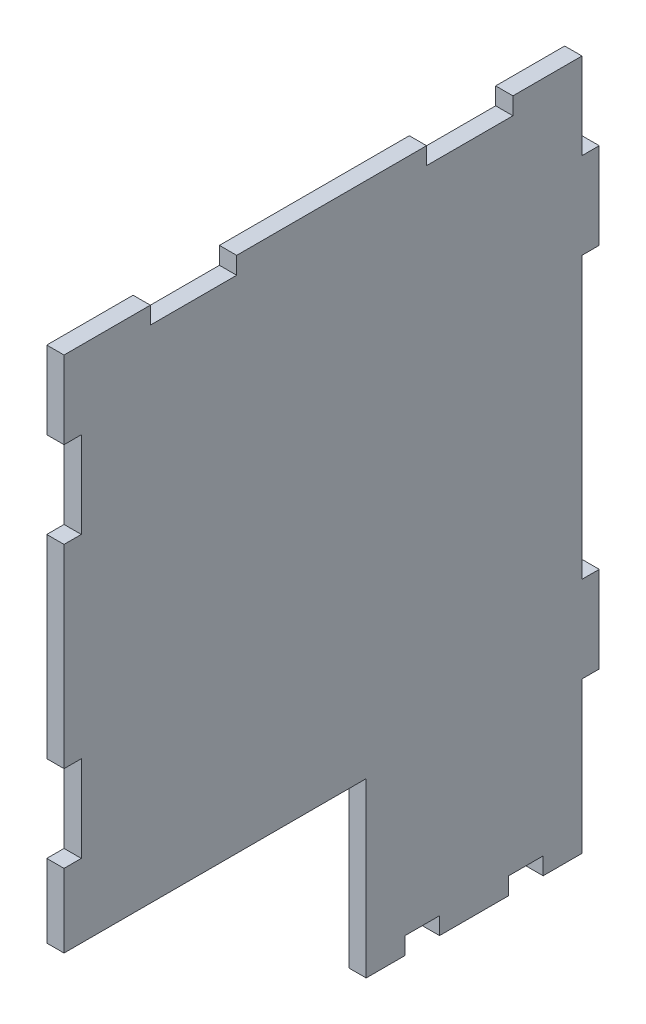
ISO-10303-21;
HEADER;
FILE_DESCRIPTION(('STEP AP214'),'2;1');
FILE_NAME('part.step','',(''),(''),'','','');
FILE_SCHEMA(('AUTOMOTIVE_DESIGN { 1 0 10303 214 1 1 1 1 }'));
ENDSEC;
DATA;
#1=APPLICATION_CONTEXT('core data for automotive mechanical design processes');
#2=APPLICATION_PROTOCOL_DEFINITION('international standard','automotive_design',2000,#1);
#3=PRODUCT_CONTEXT('',#1,'mechanical');
#4=PRODUCT('Part','Part','',(#3));
#5=PRODUCT_RELATED_PRODUCT_CATEGORY('part','',(#4));
#6=PRODUCT_DEFINITION_FORMATION('','',#4);
#7=PRODUCT_DEFINITION_CONTEXT('part definition',#1,'design');
#8=PRODUCT_DEFINITION('design','',#6,#7);
#9=PRODUCT_DEFINITION_SHAPE('','',#8);
#10=(LENGTH_UNIT() NAMED_UNIT(*) SI_UNIT(.MILLI.,.METRE.));
#11=(NAMED_UNIT(*) PLANE_ANGLE_UNIT() SI_UNIT($,.RADIAN.));
#12=(NAMED_UNIT(*) SI_UNIT($,.STERADIAN.) SOLID_ANGLE_UNIT());
#13=UNCERTAINTY_MEASURE_WITH_UNIT(LENGTH_MEASURE(1.E-05),#10,'distance_accuracy_value','');
#14=(GEOMETRIC_REPRESENTATION_CONTEXT(3) GLOBAL_UNCERTAINTY_ASSIGNED_CONTEXT((#13)) GLOBAL_UNIT_ASSIGNED_CONTEXT((#10,
#11,#12)) REPRESENTATION_CONTEXT('',''));
#15=CARTESIAN_POINT('',(0.,0.,0.));
#16=DIRECTION('',(0.,0.,1.));
#17=DIRECTION('',(1.,0.,0.));
#18=AXIS2_PLACEMENT_3D('',#15,#16,#17);
#19=CARTESIAN_POINT('',(-101.6,101.6,152.4));
#20=DIRECTION('',(0.,-1.,0.));
#21=DIRECTION('',(0.,0.,-1.));
#22=AXIS2_PLACEMENT_3D('',#19,#20,#21);
#23=PLANE('',#22);
#24=DIRECTION('',(0.,0.,-1.));
#25=VECTOR('',#24,1.);
#26=CARTESIAN_POINT('',(-96.52,101.6,152.4));
#27=LINE('',#26,#25);
#28=CARTESIAN_POINT('',(-96.52,101.6,101.6));
#29=VERTEX_POINT('',#28);
#30=CARTESIAN_POINT('',(-96.52,101.6,45.72));
#31=VERTEX_POINT('',#30);
#32=EDGE_CURVE('E548',#29,#31,#27,.T.);
#33=ORIENTED_EDGE('',*,*,#32,.T.);
#34=DIRECTION('',(1.,0.,0.));
#35=VECTOR('',#34,1.);
#36=CARTESIAN_POINT('',(-101.6,101.6,45.72));
#37=LINE('',#36,#35);
#38=CARTESIAN_POINT('',(-101.6,101.6,45.72));
#39=VERTEX_POINT('',#38);
#40=EDGE_CURVE('E312',#39,#31,#37,.T.);
#41=ORIENTED_EDGE('',*,*,#40,.F.);
#42=DIRECTION('',(0.,0.,-1.));
#43=VECTOR('',#42,1.);
#44=CARTESIAN_POINT('',(-101.6,101.6,152.4));
#45=LINE('',#44,#43);
#46=CARTESIAN_POINT('',(-101.6,101.6,101.6));
#47=VERTEX_POINT('',#46);
#48=EDGE_CURVE('E303',#47,#39,#45,.T.);
#49=ORIENTED_EDGE('',*,*,#48,.F.);
#50=DIRECTION('',(1.,0.,0.));
#51=VECTOR('',#50,1.);
#52=CARTESIAN_POINT('',(-101.6,101.6,101.6));
#53=LINE('',#52,#51);
#54=EDGE_CURVE('E386',#47,#29,#53,.T.);
#55=ORIENTED_EDGE('',*,*,#54,.T.);
#56=EDGE_LOOP('',(#33,#41,#49,#55));
#57=FACE_BOUND('',#56,.T.);
#58=ADVANCED_FACE('F33',(#57),#23,.F.);
#59=CARTESIAN_POINT('',(-96.52,101.6,152.4));
#60=VERTEX_POINT('',#59);
#61=CARTESIAN_POINT('',(-96.52,101.6,127.));
#62=VERTEX_POINT('',#61);
#63=EDGE_CURVE('E545',#60,#62,#27,.T.);
#64=ORIENTED_EDGE('',*,*,#63,.T.);
#65=DIRECTION('',(1.,0.,0.));
#66=VECTOR('',#65,1.);
#67=CARTESIAN_POINT('',(-101.6,101.6,127.));
#68=LINE('',#67,#66);
#69=CARTESIAN_POINT('',(-101.6,101.6,127.));
#70=VERTEX_POINT('',#69);
#71=EDGE_CURVE('E383',#70,#62,#68,.T.);
#72=ORIENTED_EDGE('',*,*,#71,.F.);
#73=CARTESIAN_POINT('',(-101.6,101.6,152.4));
#74=VERTEX_POINT('',#73);
#75=EDGE_CURVE('E541',#74,#70,#45,.T.);
#76=ORIENTED_EDGE('',*,*,#75,.F.);
#77=DIRECTION('',(-1.,0.,0.));
#78=VECTOR('',#77,1.);
#79=CARTESIAN_POINT('',(-101.6,101.6,152.4));
#80=LINE('',#79,#78);
#81=EDGE_CURVE('E522',#60,#74,#80,.T.);
#82=ORIENTED_EDGE('',*,*,#81,.F.);
#83=EDGE_LOOP('',(#64,#72,#76,#82));
#84=FACE_BOUND('',#83,.T.);
#85=ADVANCED_FACE('F614',(#84),#23,.F.);
#86=CARTESIAN_POINT('',(0.,0.,152.4));
#87=DIRECTION('',(0.,0.,1.));
#88=DIRECTION('',(1.,0.,0.));
#89=AXIS2_PLACEMENT_3D('',#86,#87,#88);
#90=PLANE('',#89);
#91=DIRECTION('',(1.,0.,0.));
#92=VECTOR('',#91,1.);
#93=CARTESIAN_POINT('',(-101.6,-3.81000000000001,152.4));
#94=LINE('',#93,#92);
#95=CARTESIAN_POINT('',(-101.6,-3.81000000000001,152.4));
#96=VERTEX_POINT('',#95);
#97=CARTESIAN_POINT('',(-96.52,-3.81000000000001,152.4));
#98=VERTEX_POINT('',#97);
#99=EDGE_CURVE('E333',#96,#98,#94,.T.);
#100=ORIENTED_EDGE('',*,*,#99,.T.);
#101=DIRECTION('',(0.,1.,0.));
#102=VECTOR('',#101,1.);
#103=CARTESIAN_POINT('',(-96.52,101.6,152.4));
#104=LINE('',#103,#102);
#105=CARTESIAN_POINT('',(-96.52,53.34,152.4));
#106=VERTEX_POINT('',#105);
#107=EDGE_CURVE('E523',#98,#106,#104,.T.);
#108=ORIENTED_EDGE('',*,*,#107,.T.);
#109=DIRECTION('',(1.,0.,0.));
#110=VECTOR('',#109,1.);
#111=CARTESIAN_POINT('',(-101.6,53.34,152.4));
#112=LINE('',#111,#110);
#113=CARTESIAN_POINT('',(-101.6,53.34,152.4));
#114=VERTEX_POINT('',#113);
#115=EDGE_CURVE('E328',#114,#106,#112,.T.);
#116=ORIENTED_EDGE('',*,*,#115,.F.);
#117=DIRECTION('',(0.,-1.,0.));
#118=VECTOR('',#117,1.);
#119=CARTESIAN_POINT('',(-101.6,101.6,152.4));
#120=LINE('',#119,#118);
#121=EDGE_CURVE('E517',#114,#96,#120,.T.);
#122=ORIENTED_EDGE('',*,*,#121,.T.);
#123=EDGE_LOOP('',(#100,#108,#116,#122));
#124=FACE_BOUND('',#123,.T.);
#125=ADVANCED_FACE('F625',(#124),#90,.T.);
#126=DIRECTION('',(1.,0.,0.));
#127=VECTOR('',#126,1.);
#128=CARTESIAN_POINT('',(-101.6,78.74,152.4));
#129=LINE('',#128,#127);
#130=CARTESIAN_POINT('',(-101.6,78.74,152.4));
#131=VERTEX_POINT('',#130);
#132=CARTESIAN_POINT('',(-96.52,78.74,152.4));
#133=VERTEX_POINT('',#132);
#134=EDGE_CURVE('E310',#131,#133,#129,.T.);
#135=ORIENTED_EDGE('',*,*,#134,.T.);
#136=EDGE_CURVE('E516',#133,#60,#104,.T.);
#137=ORIENTED_EDGE('',*,*,#136,.T.);
#138=ORIENTED_EDGE('',*,*,#81,.T.);
#139=EDGE_CURVE('E513',#74,#131,#120,.T.);
#140=ORIENTED_EDGE('',*,*,#139,.T.);
#141=EDGE_LOOP('',(#135,#137,#138,#140));
#142=FACE_BOUND('',#141,.T.);
#143=ADVANCED_FACE('F619',(#142),#90,.T.);
#144=CARTESIAN_POINT('',(0.,0.,0.));
#145=DIRECTION('',(0.,0.,1.));
#146=DIRECTION('',(1.,0.,0.));
#147=AXIS2_PLACEMENT_3D('',#144,#145,#146);
#148=PLANE('',#147);
#149=DIRECTION('',(1.,0.,0.));
#150=VECTOR('',#149,1.);
#151=CARTESIAN_POINT('',(-101.6,76.1999999999999,0.));
#152=LINE('',#151,#150);
#153=CARTESIAN_POINT('',(-101.6,76.1999999999999,0.));
#154=VERTEX_POINT('',#153);
#155=CARTESIAN_POINT('',(-96.52,76.1999999999999,0.));
#156=VERTEX_POINT('',#155);
#157=EDGE_CURVE('E403',#154,#156,#152,.T.);
#158=ORIENTED_EDGE('',*,*,#157,.F.);
#159=DIRECTION('',(0.,-1.,0.));
#160=VECTOR('',#159,1.);
#161=CARTESIAN_POINT('',(-101.6,101.6,0.));
#162=LINE('',#161,#160);
#163=CARTESIAN_POINT('',(-101.6,101.6,0.));
#164=VERTEX_POINT('',#163);
#165=EDGE_CURVE('E526',#164,#154,#162,.T.);
#166=ORIENTED_EDGE('',*,*,#165,.F.);
#167=DIRECTION('',(-1.,0.,0.));
#168=VECTOR('',#167,1.);
#169=CARTESIAN_POINT('',(-101.6,101.6,0.));
#170=LINE('',#169,#168);
#171=CARTESIAN_POINT('',(-96.52,101.6,0.));
#172=VERTEX_POINT('',#171);
#173=EDGE_CURVE('E537',#172,#164,#170,.T.);
#174=ORIENTED_EDGE('',*,*,#173,.F.);
#175=DIRECTION('',(0.,1.,0.));
#176=VECTOR('',#175,1.);
#177=CARTESIAN_POINT('',(-96.52,101.6,0.));
#178=LINE('',#177,#176);
#179=EDGE_CURVE('E533',#156,#172,#178,.T.);
#180=ORIENTED_EDGE('',*,*,#179,.F.);
#181=EDGE_LOOP('',(#158,#166,#174,#180));
#182=FACE_BOUND('',#181,.T.);
#183=ADVANCED_FACE('F595',(#182),#148,.F.);
#184=DIRECTION('',(-1.,0.,0.));
#185=VECTOR('',#184,1.);
#186=CARTESIAN_POINT('',(-96.52,-57.15,0.));
#187=LINE('',#186,#185);
#188=CARTESIAN_POINT('',(-96.52,-57.15,0.));
#189=VERTEX_POINT('',#188);
#190=CARTESIAN_POINT('',(-101.6,-57.15,0.));
#191=VERTEX_POINT('',#190);
#192=EDGE_CURVE('E420',#189,#191,#187,.T.);
#193=ORIENTED_EDGE('',*,*,#192,.F.);
#194=CARTESIAN_POINT('',(-96.52,-101.6,0.));
#195=VERTEX_POINT('',#194);
#196=EDGE_CURVE('E534',#195,#189,#178,.T.);
#197=ORIENTED_EDGE('',*,*,#196,.F.);
#198=DIRECTION('',(1.,0.,0.));
#199=VECTOR('',#198,1.);
#200=CARTESIAN_POINT('',(-101.6,-101.6,0.));
#201=LINE('',#200,#199);
#202=CARTESIAN_POINT('',(-101.6,-101.6,0.));
#203=VERTEX_POINT('',#202);
#204=EDGE_CURVE('E529',#203,#195,#201,.T.);
#205=ORIENTED_EDGE('',*,*,#204,.F.);
#206=EDGE_CURVE('E508',#191,#203,#162,.T.);
#207=ORIENTED_EDGE('',*,*,#206,.F.);
#208=EDGE_LOOP('',(#193,#197,#205,#207));
#209=FACE_BOUND('',#208,.T.);
#210=ADVANCED_FACE('F569',(#209),#148,.F.);
#211=CARTESIAN_POINT('',(-101.6,101.6,152.4));
#212=DIRECTION('',(1.,0.,0.));
#213=DIRECTION('',(0.,0.,-1.));
#214=AXIS2_PLACEMENT_3D('',#211,#212,#213);
#215=PLANE('',#214);
#216=DIRECTION('',(0.,1.,0.));
#217=VECTOR('',#216,1.);
#218=CARTESIAN_POINT('',(-101.6,-29.21,147.32));
#219=LINE('',#218,#217);
#220=CARTESIAN_POINT('',(-101.6,-29.21,147.32));
#221=VERTEX_POINT('',#220);
#222=CARTESIAN_POINT('',(-101.6,-3.81000000000001,147.32));
#223=VERTEX_POINT('',#222);
#224=EDGE_CURVE('E347',#221,#223,#219,.T.);
#225=ORIENTED_EDGE('',*,*,#224,.T.);
#226=DIRECTION('',(0.,0.,1.));
#227=VECTOR('',#226,1.);
#228=CARTESIAN_POINT('',(-101.6,-3.81000000000001,152.4));
#229=LINE('',#228,#227);
#230=EDGE_CURVE('E350',#223,#96,#229,.T.);
#231=ORIENTED_EDGE('',*,*,#230,.T.);
#232=ORIENTED_EDGE('',*,*,#121,.F.);
#233=DIRECTION('',(0.,0.,-1.));
#234=VECTOR('',#233,1.);
#235=CARTESIAN_POINT('',(-101.6,53.34,152.4));
#236=LINE('',#235,#234);
#237=CARTESIAN_POINT('',(-101.6,53.34,147.32));
#238=VERTEX_POINT('',#237);
#239=EDGE_CURVE('E318',#114,#238,#236,.T.);
#240=ORIENTED_EDGE('',*,*,#239,.T.);
#241=DIRECTION('',(0.,1.,0.));
#242=VECTOR('',#241,1.);
#243=CARTESIAN_POINT('',(-101.6,78.74,147.32));
#244=LINE('',#243,#242);
#245=CARTESIAN_POINT('',(-101.6,78.74,147.32));
#246=VERTEX_POINT('',#245);
#247=EDGE_CURVE('E321',#238,#246,#244,.T.);
#248=ORIENTED_EDGE('',*,*,#247,.T.);
#249=DIRECTION('',(0.,0.,1.));
#250=VECTOR('',#249,1.);
#251=CARTESIAN_POINT('',(-101.6,78.74,152.4));
#252=LINE('',#251,#250);
#253=EDGE_CURVE('E325',#246,#131,#252,.T.);
#254=ORIENTED_EDGE('',*,*,#253,.T.);
#255=ORIENTED_EDGE('',*,*,#139,.F.);
#256=ORIENTED_EDGE('',*,*,#75,.T.);
#257=DIRECTION('',(0.,-1.,0.));
#258=VECTOR('',#257,1.);
#259=CARTESIAN_POINT('',(-101.6,101.6,127.));
#260=LINE('',#259,#258);
#261=CARTESIAN_POINT('',(-101.6,96.52,127.));
#262=VERTEX_POINT('',#261);
#263=EDGE_CURVE('E368',#70,#262,#260,.T.);
#264=ORIENTED_EDGE('',*,*,#263,.T.);
#265=DIRECTION('',(0.,0.,-1.));
#266=VECTOR('',#265,1.);
#267=CARTESIAN_POINT('',(-101.6,96.52,127.));
#268=LINE('',#267,#266);
#269=CARTESIAN_POINT('',(-101.6,96.52,101.6));
#270=VERTEX_POINT('',#269);
#271=EDGE_CURVE('E371',#262,#270,#268,.T.);
#272=ORIENTED_EDGE('',*,*,#271,.T.);
#273=DIRECTION('',(0.,1.,0.));
#274=VECTOR('',#273,1.);
#275=CARTESIAN_POINT('',(-101.6,101.6,101.6));
#276=LINE('',#275,#274);
#277=EDGE_CURVE('E374',#270,#47,#276,.T.);
#278=ORIENTED_EDGE('',*,*,#277,.T.);
#279=ORIENTED_EDGE('',*,*,#48,.T.);
#280=DIRECTION('',(0.,-1.,0.));
#281=VECTOR('',#280,1.);
#282=CARTESIAN_POINT('',(-101.6,101.6,45.72));
#283=LINE('',#282,#281);
#284=CARTESIAN_POINT('',(-101.6,96.52,45.72));
#285=VERTEX_POINT('',#284);
#286=EDGE_CURVE('E282',#39,#285,#283,.T.);
#287=ORIENTED_EDGE('',*,*,#286,.T.);
#288=DIRECTION('',(0.,0.,-1.));
#289=VECTOR('',#288,1.);
#290=CARTESIAN_POINT('',(-101.6,96.52,45.72));
#291=LINE('',#290,#289);
#292=CARTESIAN_POINT('',(-101.6,96.52,20.32));
#293=VERTEX_POINT('',#292);
#294=EDGE_CURVE('E293',#285,#293,#291,.T.);
#295=ORIENTED_EDGE('',*,*,#294,.T.);
#296=DIRECTION('',(0.,1.,0.));
#297=VECTOR('',#296,1.);
#298=CARTESIAN_POINT('',(-101.6,101.6,20.32));
#299=LINE('',#298,#297);
#300=CARTESIAN_POINT('',(-101.6,101.6,20.32));
#301=VERTEX_POINT('',#300);
#302=EDGE_CURVE('E290',#293,#301,#299,.T.);
#303=ORIENTED_EDGE('',*,*,#302,.T.);
#304=EDGE_CURVE('E525',#301,#164,#45,.T.);
#305=ORIENTED_EDGE('',*,*,#304,.T.);
#306=ORIENTED_EDGE('',*,*,#165,.T.);
#307=DIRECTION('',(0.,0.,1.));
#308=VECTOR('',#307,1.);
#309=CARTESIAN_POINT('',(-101.6,76.1999999999999,-5.08));
#310=LINE('',#309,#308);
#311=CARTESIAN_POINT('',(-101.6,76.1999999999999,-5.08));
#312=VERTEX_POINT('',#311);
#313=EDGE_CURVE('E397',#312,#154,#310,.T.);
#314=ORIENTED_EDGE('',*,*,#313,.F.);
#315=DIRECTION('',(0.,1.,0.));
#316=VECTOR('',#315,1.);
#317=CARTESIAN_POINT('',(-101.6,50.7999999999999,-5.08));
#318=LINE('',#317,#316);
#319=CARTESIAN_POINT('',(-101.6,50.7999999999999,-5.08));
#320=VERTEX_POINT('',#319);
#321=EDGE_CURVE('E399',#320,#312,#318,.T.);
#322=ORIENTED_EDGE('',*,*,#321,.F.);
#323=DIRECTION('',(0.,0.,1.));
#324=VECTOR('',#323,1.);
#325=CARTESIAN_POINT('',(-101.6,50.7999999999999,-5.08));
#326=LINE('',#325,#324);
#327=CARTESIAN_POINT('',(-101.6,50.7999999999999,0.));
#328=VERTEX_POINT('',#327);
#329=EDGE_CURVE('E394',#320,#328,#326,.T.);
#330=ORIENTED_EDGE('',*,*,#329,.T.);
#331=CARTESIAN_POINT('',(-101.6,-31.75,0.));
#332=VERTEX_POINT('',#331);
#333=EDGE_CURVE('E530',#328,#332,#162,.T.);
#334=ORIENTED_EDGE('',*,*,#333,.T.);
#335=DIRECTION('',(0.,0.,1.));
#336=VECTOR('',#335,1.);
#337=CARTESIAN_POINT('',(-101.6,-31.75,-5.08));
#338=LINE('',#337,#336);
#339=CARTESIAN_POINT('',(-101.6,-31.75,-5.08));
#340=VERTEX_POINT('',#339);
#341=EDGE_CURVE('E427',#340,#332,#338,.T.);
#342=ORIENTED_EDGE('',*,*,#341,.F.);
#343=DIRECTION('',(0.,1.,0.));
#344=VECTOR('',#343,1.);
#345=CARTESIAN_POINT('',(-101.6,-57.15,-5.08));
#346=LINE('',#345,#344);
#347=CARTESIAN_POINT('',(-101.6,-57.15,-5.08));
#348=VERTEX_POINT('',#347);
#349=EDGE_CURVE('E419',#348,#340,#346,.T.);
#350=ORIENTED_EDGE('',*,*,#349,.F.);
#351=DIRECTION('',(0.,0.,1.));
#352=VECTOR('',#351,1.);
#353=CARTESIAN_POINT('',(-101.6,-57.15,-5.08));
#354=LINE('',#353,#352);
#355=EDGE_CURVE('E439',#348,#191,#354,.T.);
#356=ORIENTED_EDGE('',*,*,#355,.T.);
#357=ORIENTED_EDGE('',*,*,#206,.T.);
#358=DIRECTION('',(0.,0.,-1.));
#359=VECTOR('',#358,1.);
#360=CARTESIAN_POINT('',(-101.6,-101.6,152.4));
#361=LINE('',#360,#359);
#362=CARTESIAN_POINT('',(-101.6,-101.6,11.43));
#363=VERTEX_POINT('',#362);
#364=EDGE_CURVE('E42',#363,#203,#361,.T.);
#365=ORIENTED_EDGE('',*,*,#364,.F.);
#366=DIRECTION('',(0.,-1.,0.));
#367=VECTOR('',#366,1.);
#368=CARTESIAN_POINT('',(-101.6,-96.52,11.43));
#369=LINE('',#368,#367);
#370=CARTESIAN_POINT('',(-101.6,-96.52,11.43));
#371=VERTEX_POINT('',#370);
#372=EDGE_CURVE('E482',#371,#363,#369,.T.);
#373=ORIENTED_EDGE('',*,*,#372,.F.);
#374=DIRECTION('',(0.,0.,-1.));
#375=VECTOR('',#374,1.);
#376=CARTESIAN_POINT('',(-101.6,-96.52,0.));
#377=LINE('',#376,#375);
#378=CARTESIAN_POINT('',(-101.6,-96.52,21.59));
#379=VERTEX_POINT('',#378);
#380=EDGE_CURVE('E471',#379,#371,#377,.T.);
#381=ORIENTED_EDGE('',*,*,#380,.F.);
#382=DIRECTION('',(0.,-1.,0.));
#383=VECTOR('',#382,1.);
#384=CARTESIAN_POINT('',(-101.6,-96.52,21.59));
#385=LINE('',#384,#383);
#386=CARTESIAN_POINT('',(-101.6,-101.6,21.59));
#387=VERTEX_POINT('',#386);
#388=EDGE_CURVE('E458',#379,#387,#385,.T.);
#389=ORIENTED_EDGE('',*,*,#388,.T.);
#390=CARTESIAN_POINT('',(-101.6,-101.6,41.91));
#391=VERTEX_POINT('',#390);
#392=EDGE_CURVE('E41',#391,#387,#361,.T.);
#393=ORIENTED_EDGE('',*,*,#392,.F.);
#394=DIRECTION('',(0.,-1.,0.));
#395=VECTOR('',#394,1.);
#396=CARTESIAN_POINT('',(-101.6,-96.52,41.91));
#397=LINE('',#396,#395);
#398=CARTESIAN_POINT('',(-101.6,-96.52,41.91));
#399=VERTEX_POINT('',#398);
#400=EDGE_CURVE('E455',#399,#391,#397,.T.);
#401=ORIENTED_EDGE('',*,*,#400,.F.);
#402=DIRECTION('',(0.,0.,-1.));
#403=VECTOR('',#402,1.);
#404=CARTESIAN_POINT('',(-101.6,-96.52,0.));
#405=LINE('',#404,#403);
#406=CARTESIAN_POINT('',(-101.6,-96.52,52.07));
#407=VERTEX_POINT('',#406);
#408=EDGE_CURVE('E444',#407,#399,#405,.T.);
#409=ORIENTED_EDGE('',*,*,#408,.F.);
#410=DIRECTION('',(0.,-1.,0.));
#411=VECTOR('',#410,1.);
#412=CARTESIAN_POINT('',(-101.6,-96.52,52.07));
#413=LINE('',#412,#411);
#414=CARTESIAN_POINT('',(-101.6,-101.6,52.07));
#415=VERTEX_POINT('',#414);
#416=EDGE_CURVE('E461',#407,#415,#413,.T.);
#417=ORIENTED_EDGE('',*,*,#416,.T.);
#418=CARTESIAN_POINT('',(-101.6,-101.6,63.5));
#419=VERTEX_POINT('',#418);
#420=EDGE_CURVE('E11',#419,#415,#361,.T.);
#421=ORIENTED_EDGE('',*,*,#420,.F.);
#422=DIRECTION('',(0.,-1.,0.));
#423=VECTOR('',#422,1.);
#424=CARTESIAN_POINT('',(-101.6,-101.6,63.5));
#425=LINE('',#424,#423);
#426=CARTESIAN_POINT('',(-101.6,-50.8,63.5));
#427=VERTEX_POINT('',#426);
#428=EDGE_CURVE('E498',#427,#419,#425,.T.);
#429=ORIENTED_EDGE('',*,*,#428,.F.);
#430=DIRECTION('',(0.,0.,-1.));
#431=VECTOR('',#430,1.);
#432=CARTESIAN_POINT('',(-101.6,-50.8,152.4));
#433=LINE('',#432,#431);
#434=CARTESIAN_POINT('',(-101.6,-50.8,152.4));
#435=VERTEX_POINT('',#434);
#436=EDGE_CURVE('E464',#435,#427,#433,.T.);
#437=ORIENTED_EDGE('',*,*,#436,.F.);
#438=CARTESIAN_POINT('',(-101.6,-29.21,152.4));
#439=VERTEX_POINT('',#438);
#440=EDGE_CURVE('E518',#439,#435,#120,.T.);
#441=ORIENTED_EDGE('',*,*,#440,.F.);
#442=DIRECTION('',(0.,0.,-1.));
#443=VECTOR('',#442,1.);
#444=CARTESIAN_POINT('',(-101.6,-29.21,152.4));
#445=LINE('',#444,#443);
#446=EDGE_CURVE('E344',#439,#221,#445,.T.);
#447=ORIENTED_EDGE('',*,*,#446,.T.);
#448=EDGE_LOOP('',(#225,#231,#232,#240,#248,#254,#255,#256,#264,#272,#278,#279,#287,#295,#303,
#305,#306,#314,#322,#330,#334,#342,#350,#356,#357,#365,#373,#381,#389,#393,#401,#409,#417,#421,
#429,#437,#441,#447));
#449=FACE_BOUND('',#448,.T.);
#450=ADVANCED_FACE('F35',(#449),#215,.F.);
#451=CARTESIAN_POINT('',(-101.6,-101.6,152.4));
#452=DIRECTION('',(0.,1.,0.));
#453=DIRECTION('',(0.,0.,1.));
#454=AXIS2_PLACEMENT_3D('',#451,#452,#453);
#455=PLANE('',#454);
#456=DIRECTION('',(1.,0.,0.));
#457=VECTOR('',#456,1.);
#458=CARTESIAN_POINT('',(0.,-101.6,52.07));
#459=LINE('',#458,#457);
#460=CARTESIAN_POINT('',(-96.52,-101.6,52.07));
#461=VERTEX_POINT('',#460);
#462=EDGE_CURVE('E448',#415,#461,#459,.T.);
#463=ORIENTED_EDGE('',*,*,#462,.T.);
#464=DIRECTION('',(0.,0.,-1.));
#465=VECTOR('',#464,1.);
#466=CARTESIAN_POINT('',(-96.52,-101.6,152.4));
#467=LINE('',#466,#465);
#468=CARTESIAN_POINT('',(-96.52,-101.6,63.5));
#469=VERTEX_POINT('',#468);
#470=EDGE_CURVE('E549',#469,#461,#467,.T.);
#471=ORIENTED_EDGE('',*,*,#470,.F.);
#472=DIRECTION('',(-1.,0.,0.));
#473=VECTOR('',#472,1.);
#474=CARTESIAN_POINT('',(-96.52,-101.6,63.5));
#475=LINE('',#474,#473);
#476=EDGE_CURVE('E505',#469,#419,#475,.T.);
#477=ORIENTED_EDGE('',*,*,#476,.T.);
#478=ORIENTED_EDGE('',*,*,#420,.T.);
#479=EDGE_LOOP('',(#463,#471,#477,#478));
#480=FACE_BOUND('',#479,.T.);
#481=ADVANCED_FACE('F651',(#480),#455,.F.);
#482=CARTESIAN_POINT('',(-96.52,-101.6,41.91));
#483=VERTEX_POINT('',#482);
#484=CARTESIAN_POINT('',(-96.52,-101.6,21.59));
#485=VERTEX_POINT('',#484);
#486=EDGE_CURVE('E551',#483,#485,#467,.T.);
#487=ORIENTED_EDGE('',*,*,#486,.F.);
#488=DIRECTION('',(1.,0.,0.));
#489=VECTOR('',#488,1.);
#490=CARTESIAN_POINT('',(0.,-101.6,41.91));
#491=LINE('',#490,#489);
#492=EDGE_CURVE('E456',#391,#483,#491,.T.);
#493=ORIENTED_EDGE('',*,*,#492,.F.);
#494=ORIENTED_EDGE('',*,*,#392,.T.);
#495=DIRECTION('',(1.,0.,0.));
#496=VECTOR('',#495,1.);
#497=CARTESIAN_POINT('',(0.,-101.6,21.59));
#498=LINE('',#497,#496);
#499=EDGE_CURVE('E475',#387,#485,#498,.T.);
#500=ORIENTED_EDGE('',*,*,#499,.T.);
#501=EDGE_LOOP('',(#487,#493,#494,#500));
#502=FACE_BOUND('',#501,.T.);
#503=ADVANCED_FACE('F667',(#502),#455,.F.);
#504=CARTESIAN_POINT('',(-96.52,101.6,152.4));
#505=DIRECTION('',(-1.,0.,0.));
#506=DIRECTION('',(0.,-1.,0.));
#507=AXIS2_PLACEMENT_3D('',#504,#505,#506);
#508=PLANE('',#507);
#509=ORIENTED_EDGE('',*,*,#107,.F.);
#510=DIRECTION('',(0.,0.,1.));
#511=VECTOR('',#510,1.);
#512=CARTESIAN_POINT('',(-96.52,-3.81000000000001,152.4));
#513=LINE('',#512,#511);
#514=CARTESIAN_POINT('',(-96.52,-3.81000000000001,147.32));
#515=VERTEX_POINT('',#514);
#516=EDGE_CURVE('E348',#515,#98,#513,.T.);
#517=ORIENTED_EDGE('',*,*,#516,.F.);
#518=DIRECTION('',(0.,1.,0.));
#519=VECTOR('',#518,1.);
#520=CARTESIAN_POINT('',(-96.52,-29.21,147.32));
#521=LINE('',#520,#519);
#522=CARTESIAN_POINT('',(-96.52,-29.21,147.32));
#523=VERTEX_POINT('',#522);
#524=EDGE_CURVE('E357',#523,#515,#521,.T.);
#525=ORIENTED_EDGE('',*,*,#524,.F.);
#526=DIRECTION('',(0.,0.,-1.));
#527=VECTOR('',#526,1.);
#528=CARTESIAN_POINT('',(-96.52,-29.21,152.4));
#529=LINE('',#528,#527);
#530=CARTESIAN_POINT('',(-96.52,-29.21,152.4));
#531=VERTEX_POINT('',#530);
#532=EDGE_CURVE('E354',#531,#523,#529,.T.);
#533=ORIENTED_EDGE('',*,*,#532,.F.);
#534=CARTESIAN_POINT('',(-96.52,-50.8,152.4));
#535=VERTEX_POINT('',#534);
#536=EDGE_CURVE('E519',#535,#531,#104,.T.);
#537=ORIENTED_EDGE('',*,*,#536,.F.);
#538=DIRECTION('',(0.,0.,-1.));
#539=VECTOR('',#538,1.);
#540=CARTESIAN_POINT('',(-96.52,-50.8,152.4));
#541=LINE('',#540,#539);
#542=CARTESIAN_POINT('',(-96.52,-50.8,63.5));
#543=VERTEX_POINT('',#542);
#544=EDGE_CURVE('E494',#535,#543,#541,.T.);
#545=ORIENTED_EDGE('',*,*,#544,.T.);
#546=DIRECTION('',(0.,-1.,0.));
#547=VECTOR('',#546,1.);
#548=CARTESIAN_POINT('',(-96.52,-101.6,63.5));
#549=LINE('',#548,#547);
#550=EDGE_CURVE('E497',#543,#469,#549,.T.);
#551=ORIENTED_EDGE('',*,*,#550,.T.);
#552=ORIENTED_EDGE('',*,*,#470,.T.);
#553=DIRECTION('',(0.,-1.,0.));
#554=VECTOR('',#553,1.);
#555=CARTESIAN_POINT('',(-96.52,-96.52,52.07));
#556=LINE('',#555,#554);
#557=CARTESIAN_POINT('',(-96.52,-96.52,52.07));
#558=VERTEX_POINT('',#557);
#559=EDGE_CURVE('E465',#558,#461,#556,.T.);
#560=ORIENTED_EDGE('',*,*,#559,.F.);
#561=DIRECTION('',(0.,0.,1.));
#562=VECTOR('',#561,1.);
#563=CARTESIAN_POINT('',(-96.52,-96.52,0.));
#564=LINE('',#563,#562);
#565=CARTESIAN_POINT('',(-96.52,-96.52,41.91));
#566=VERTEX_POINT('',#565);
#567=EDGE_CURVE('E450',#566,#558,#564,.T.);
#568=ORIENTED_EDGE('',*,*,#567,.F.);
#569=DIRECTION('',(0.,-1.,0.));
#570=VECTOR('',#569,1.);
#571=CARTESIAN_POINT('',(-96.52,-96.52,41.91));
#572=LINE('',#571,#570);
#573=EDGE_CURVE('E467',#566,#483,#572,.T.);
#574=ORIENTED_EDGE('',*,*,#573,.T.);
#575=ORIENTED_EDGE('',*,*,#486,.T.);
#576=DIRECTION('',(0.,-1.,0.));
#577=VECTOR('',#576,1.);
#578=CARTESIAN_POINT('',(-96.52,-96.52,21.59));
#579=LINE('',#578,#577);
#580=CARTESIAN_POINT('',(-96.52,-96.52,21.59));
#581=VERTEX_POINT('',#580);
#582=EDGE_CURVE('E488',#581,#485,#579,.T.);
#583=ORIENTED_EDGE('',*,*,#582,.F.);
#584=DIRECTION('',(0.,0.,1.));
#585=VECTOR('',#584,1.);
#586=CARTESIAN_POINT('',(-96.52,-96.52,0.));
#587=LINE('',#586,#585);
#588=CARTESIAN_POINT('',(-96.52,-96.52,11.43));
#589=VERTEX_POINT('',#588);
#590=EDGE_CURVE('E477',#589,#581,#587,.T.);
#591=ORIENTED_EDGE('',*,*,#590,.F.);
#592=DIRECTION('',(0.,-1.,0.));
#593=VECTOR('',#592,1.);
#594=CARTESIAN_POINT('',(-96.52,-96.52,11.43));
#595=LINE('',#594,#593);
#596=CARTESIAN_POINT('',(-96.52,-101.6,11.43));
#597=VERTEX_POINT('',#596);
#598=EDGE_CURVE('E490',#589,#597,#595,.T.);
#599=ORIENTED_EDGE('',*,*,#598,.T.);
#600=EDGE_CURVE('E547',#597,#195,#467,.T.);
#601=ORIENTED_EDGE('',*,*,#600,.T.);
#602=ORIENTED_EDGE('',*,*,#196,.T.);
#603=DIRECTION('',(0.,0.,1.));
#604=VECTOR('',#603,1.);
#605=CARTESIAN_POINT('',(-96.52,-57.15,-5.08));
#606=LINE('',#605,#604);
#607=CARTESIAN_POINT('',(-96.52,-57.15,-5.08));
#608=VERTEX_POINT('',#607);
#609=EDGE_CURVE('E436',#608,#189,#606,.T.);
#610=ORIENTED_EDGE('',*,*,#609,.F.);
#611=DIRECTION('',(0.,1.,0.));
#612=VECTOR('',#611,1.);
#613=CARTESIAN_POINT('',(-96.52,-57.15,-5.08));
#614=LINE('',#613,#612);
#615=CARTESIAN_POINT('',(-96.52,-31.75,-5.08));
#616=VERTEX_POINT('',#615);
#617=EDGE_CURVE('E424',#608,#616,#614,.T.);
#618=ORIENTED_EDGE('',*,*,#617,.T.);
#619=DIRECTION('',(0.,0.,1.));
#620=VECTOR('',#619,1.);
#621=CARTESIAN_POINT('',(-96.52,-31.75,-5.08));
#622=LINE('',#621,#620);
#623=CARTESIAN_POINT('',(-96.52,-31.75,0.));
#624=VERTEX_POINT('',#623);
#625=EDGE_CURVE('E432',#616,#624,#622,.T.);
#626=ORIENTED_EDGE('',*,*,#625,.T.);
#627=CARTESIAN_POINT('',(-96.52,50.7999999999999,0.));
#628=VERTEX_POINT('',#627);
#629=EDGE_CURVE('E538',#624,#628,#178,.T.);
#630=ORIENTED_EDGE('',*,*,#629,.T.);
#631=DIRECTION('',(0.,0.,1.));
#632=VECTOR('',#631,1.);
#633=CARTESIAN_POINT('',(-96.52,50.7999999999999,-5.08));
#634=LINE('',#633,#632);
#635=CARTESIAN_POINT('',(-96.52,50.7999999999999,-5.08));
#636=VERTEX_POINT('',#635);
#637=EDGE_CURVE('E392',#636,#628,#634,.T.);
#638=ORIENTED_EDGE('',*,*,#637,.F.);
#639=DIRECTION('',(0.,1.,0.));
#640=VECTOR('',#639,1.);
#641=CARTESIAN_POINT('',(-96.52,50.7999999999999,-5.08));
#642=LINE('',#641,#640);
#643=CARTESIAN_POINT('',(-96.52,76.1999999999999,-5.08));
#644=VERTEX_POINT('',#643);
#645=EDGE_CURVE('E412',#636,#644,#642,.T.);
#646=ORIENTED_EDGE('',*,*,#645,.T.);
#647=DIRECTION('',(0.,0.,1.));
#648=VECTOR('',#647,1.);
#649=CARTESIAN_POINT('',(-96.52,76.1999999999999,-5.08));
#650=LINE('',#649,#648);
#651=EDGE_CURVE('E385',#644,#156,#650,.T.);
#652=ORIENTED_EDGE('',*,*,#651,.T.);
#653=ORIENTED_EDGE('',*,*,#179,.T.);
#654=CARTESIAN_POINT('',(-96.52,101.6,20.3200000000001));
#655=VERTEX_POINT('',#654);
#656=EDGE_CURVE('E544',#655,#172,#27,.T.);
#657=ORIENTED_EDGE('',*,*,#656,.F.);
#658=DIRECTION('',(0.,1.,0.));
#659=VECTOR('',#658,1.);
#660=CARTESIAN_POINT('',(-96.52,101.6,20.32));
#661=LINE('',#660,#659);
#662=CARTESIAN_POINT('',(-96.52,96.52,20.32));
#663=VERTEX_POINT('',#662);
#664=EDGE_CURVE('E49',#663,#655,#661,.T.);
#665=ORIENTED_EDGE('',*,*,#664,.F.);
#666=DIRECTION('',(0.,0.,-1.));
#667=VECTOR('',#666,1.);
#668=CARTESIAN_POINT('',(-96.52,96.52,45.72));
#669=LINE('',#668,#667);
#670=CARTESIAN_POINT('',(-96.52,96.52,45.72));
#671=VERTEX_POINT('',#670);
#672=EDGE_CURVE('E305',#671,#663,#669,.T.);
#673=ORIENTED_EDGE('',*,*,#672,.F.);
#674=DIRECTION('',(0.,-1.,0.));
#675=VECTOR('',#674,1.);
#676=CARTESIAN_POINT('',(-96.52,101.6,45.72));
#677=LINE('',#676,#675);
#678=EDGE_CURVE('E285',#31,#671,#677,.T.);
#679=ORIENTED_EDGE('',*,*,#678,.F.);
#680=ORIENTED_EDGE('',*,*,#32,.F.);
#681=DIRECTION('',(0.,1.,0.));
#682=VECTOR('',#681,1.);
#683=CARTESIAN_POINT('',(-96.52,101.6,101.6));
#684=LINE('',#683,#682);
#685=CARTESIAN_POINT('',(-96.52,96.52,101.6));
#686=VERTEX_POINT('',#685);
#687=EDGE_CURVE('E57',#686,#29,#684,.T.);
#688=ORIENTED_EDGE('',*,*,#687,.F.);
#689=DIRECTION('',(0.,0.,-1.));
#690=VECTOR('',#689,1.);
#691=CARTESIAN_POINT('',(-96.52,96.52,127.));
#692=LINE('',#691,#690);
#693=CARTESIAN_POINT('',(-96.52,96.52,127.));
#694=VERTEX_POINT('',#693);
#695=EDGE_CURVE('E379',#694,#686,#692,.T.);
#696=ORIENTED_EDGE('',*,*,#695,.F.);
#697=DIRECTION('',(0.,-1.,0.));
#698=VECTOR('',#697,1.);
#699=CARTESIAN_POINT('',(-96.52,101.6,127.));
#700=LINE('',#699,#698);
#701=EDGE_CURVE('E314',#62,#694,#700,.T.);
#702=ORIENTED_EDGE('',*,*,#701,.F.);
#703=ORIENTED_EDGE('',*,*,#63,.F.);
#704=ORIENTED_EDGE('',*,*,#136,.F.);
#705=DIRECTION('',(0.,0.,1.));
#706=VECTOR('',#705,1.);
#707=CARTESIAN_POINT('',(-96.52,78.74,152.4));
#708=LINE('',#707,#706);
#709=CARTESIAN_POINT('',(-96.52,78.74,147.32));
#710=VERTEX_POINT('',#709);
#711=EDGE_CURVE('E322',#710,#133,#708,.T.);
#712=ORIENTED_EDGE('',*,*,#711,.F.);
#713=DIRECTION('',(0.,1.,0.));
#714=VECTOR('',#713,1.);
#715=CARTESIAN_POINT('',(-96.52,78.74,147.32));
#716=LINE('',#715,#714);
#717=CARTESIAN_POINT('',(-96.52,53.34,147.32));
#718=VERTEX_POINT('',#717);
#719=EDGE_CURVE('E332',#718,#710,#716,.T.);
#720=ORIENTED_EDGE('',*,*,#719,.F.);
#721=DIRECTION('',(0.,0.,-1.));
#722=VECTOR('',#721,1.);
#723=CARTESIAN_POINT('',(-96.52,53.34,152.4));
#724=LINE('',#723,#722);
#725=EDGE_CURVE('E329',#106,#718,#724,.T.);
#726=ORIENTED_EDGE('',*,*,#725,.F.);
#727=EDGE_LOOP('',(#509,#517,#525,#533,#537,#545,#551,#552,#560,#568,#574,#575,#583,#591,#599,
#601,#602,#610,#618,#626,#630,#638,#646,#652,#653,#657,#665,#673,#679,#680,#688,#696,#702,#703,
#704,#712,#720,#726));
#728=FACE_BOUND('',#727,.T.);
#729=ADVANCED_FACE('F559',(#728),#508,.F.);
#730=ORIENTED_EDGE('',*,*,#600,.F.);
#731=DIRECTION('',(1.,0.,0.));
#732=VECTOR('',#731,1.);
#733=CARTESIAN_POINT('',(0.,-101.6,11.43));
#734=LINE('',#733,#732);
#735=EDGE_CURVE('E435',#363,#597,#734,.T.);
#736=ORIENTED_EDGE('',*,*,#735,.F.);
#737=ORIENTED_EDGE('',*,*,#364,.T.);
#738=ORIENTED_EDGE('',*,*,#204,.T.);
#739=EDGE_LOOP('',(#730,#736,#737,#738));
#740=FACE_BOUND('',#739,.T.);
#741=ADVANCED_FACE('F566',(#740),#455,.F.);
#742=ORIENTED_EDGE('',*,*,#304,.F.);
#743=DIRECTION('',(1.,0.,0.));
#744=VECTOR('',#743,1.);
#745=CARTESIAN_POINT('',(-101.6,101.6,20.32));
#746=LINE('',#745,#744);
#747=EDGE_CURVE('E315',#301,#655,#746,.T.);
#748=ORIENTED_EDGE('',*,*,#747,.T.);
#749=ORIENTED_EDGE('',*,*,#656,.T.);
#750=ORIENTED_EDGE('',*,*,#173,.T.);
#751=EDGE_LOOP('',(#742,#748,#749,#750));
#752=FACE_BOUND('',#751,.T.);
#753=ADVANCED_FACE('F598',(#752),#23,.F.);
#754=DIRECTION('',(1.,0.,0.));
#755=VECTOR('',#754,1.);
#756=CARTESIAN_POINT('',(-101.6,-29.21,152.4));
#757=LINE('',#756,#755);
#758=EDGE_CURVE('E353',#439,#531,#757,.T.);
#759=ORIENTED_EDGE('',*,*,#758,.F.);
#760=ORIENTED_EDGE('',*,*,#440,.T.);
#761=DIRECTION('',(-1.,0.,0.));
#762=VECTOR('',#761,1.);
#763=CARTESIAN_POINT('',(-96.52,-50.8,152.4));
#764=LINE('',#763,#762);
#765=EDGE_CURVE('E501',#535,#435,#764,.T.);
#766=ORIENTED_EDGE('',*,*,#765,.F.);
#767=ORIENTED_EDGE('',*,*,#536,.T.);
#768=EDGE_LOOP('',(#759,#760,#766,#767));
#769=FACE_BOUND('',#768,.T.);
#770=ADVANCED_FACE('F640',(#769),#90,.T.);
#771=ORIENTED_EDGE('',*,*,#333,.F.);
#772=DIRECTION('',(1.,0.,0.));
#773=VECTOR('',#772,1.);
#774=CARTESIAN_POINT('',(-101.6,50.7999999999999,0.));
#775=LINE('',#774,#773);
#776=EDGE_CURVE('E400',#328,#628,#775,.T.);
#777=ORIENTED_EDGE('',*,*,#776,.T.);
#778=ORIENTED_EDGE('',*,*,#629,.F.);
#779=DIRECTION('',(-1.,0.,0.));
#780=VECTOR('',#779,1.);
#781=CARTESIAN_POINT('',(-96.52,-31.75,0.));
#782=LINE('',#781,#780);
#783=EDGE_CURVE('E407',#624,#332,#782,.T.);
#784=ORIENTED_EDGE('',*,*,#783,.T.);
#785=EDGE_LOOP('',(#771,#777,#778,#784));
#786=FACE_BOUND('',#785,.T.);
#787=ADVANCED_FACE('F586',(#786),#148,.F.);
#788=CARTESIAN_POINT('',(-96.52,-101.6,63.5));
#789=DIRECTION('',(0.,0.,-1.));
#790=DIRECTION('',(-1.,0.,0.));
#791=AXIS2_PLACEMENT_3D('',#788,#789,#790);
#792=PLANE('',#791);
#793=ORIENTED_EDGE('',*,*,#428,.T.);
#794=ORIENTED_EDGE('',*,*,#476,.F.);
#795=ORIENTED_EDGE('',*,*,#550,.F.);
#796=DIRECTION('',(-1.,0.,0.));
#797=VECTOR('',#796,1.);
#798=CARTESIAN_POINT('',(-96.52,-50.8,63.5));
#799=LINE('',#798,#797);
#800=EDGE_CURVE('E509',#543,#427,#799,.T.);
#801=ORIENTED_EDGE('',*,*,#800,.T.);
#802=EDGE_LOOP('',(#793,#794,#795,#801));
#803=FACE_BOUND('',#802,.T.);
#804=ADVANCED_FACE('F648',(#803),#792,.F.);
#805=CARTESIAN_POINT('',(-96.52,-50.8,152.4));
#806=DIRECTION('',(0.,1.,0.));
#807=DIRECTION('',(0.,0.,1.));
#808=AXIS2_PLACEMENT_3D('',#805,#806,#807);
#809=PLANE('',#808);
#810=ORIENTED_EDGE('',*,*,#436,.T.);
#811=ORIENTED_EDGE('',*,*,#800,.F.);
#812=ORIENTED_EDGE('',*,*,#544,.F.);
#813=ORIENTED_EDGE('',*,*,#765,.T.);
#814=EDGE_LOOP('',(#810,#811,#812,#813));
#815=FACE_BOUND('',#814,.T.);
#816=ADVANCED_FACE('F644',(#815),#809,.F.);
#817=CARTESIAN_POINT('',(0.,-96.52,21.59));
#818=DIRECTION('',(0.,0.,-1.));
#819=DIRECTION('',(-1.,0.,0.));
#820=AXIS2_PLACEMENT_3D('',#817,#818,#819);
#821=PLANE('',#820);
#822=ORIENTED_EDGE('',*,*,#499,.F.);
#823=ORIENTED_EDGE('',*,*,#388,.F.);
#824=DIRECTION('',(1.,0.,0.));
#825=VECTOR('',#824,1.);
#826=CARTESIAN_POINT('',(0.,-96.52,21.59));
#827=LINE('',#826,#825);
#828=EDGE_CURVE('E480',#379,#581,#827,.T.);
#829=ORIENTED_EDGE('',*,*,#828,.T.);
#830=ORIENTED_EDGE('',*,*,#582,.T.);
#831=EDGE_LOOP('',(#822,#823,#829,#830));
#832=FACE_BOUND('',#831,.T.);
#833=ADVANCED_FACE('F670',(#832),#821,.T.);
#834=CARTESIAN_POINT('',(0.,-96.52,11.43));
#835=DIRECTION('',(0.,0.,-1.));
#836=DIRECTION('',(-1.,0.,0.));
#837=AXIS2_PLACEMENT_3D('',#834,#835,#836);
#838=PLANE('',#837);
#839=ORIENTED_EDGE('',*,*,#735,.T.);
#840=ORIENTED_EDGE('',*,*,#598,.F.);
#841=DIRECTION('',(1.,0.,0.));
#842=VECTOR('',#841,1.);
#843=CARTESIAN_POINT('',(0.,-96.52,11.43));
#844=LINE('',#843,#842);
#845=EDGE_CURVE('E474',#371,#589,#844,.T.);
#846=ORIENTED_EDGE('',*,*,#845,.F.);
#847=ORIENTED_EDGE('',*,*,#372,.T.);
#848=EDGE_LOOP('',(#839,#840,#846,#847));
#849=FACE_BOUND('',#848,.T.);
#850=ADVANCED_FACE('F677',(#849),#838,.F.);
#851=CARTESIAN_POINT('',(0.,-96.52,0.));
#852=DIRECTION('',(0.,-1.,0.));
#853=DIRECTION('',(0.,0.,-1.));
#854=AXIS2_PLACEMENT_3D('',#851,#852,#853);
#855=PLANE('',#854);
#856=ORIENTED_EDGE('',*,*,#380,.T.);
#857=ORIENTED_EDGE('',*,*,#845,.T.);
#858=ORIENTED_EDGE('',*,*,#590,.T.);
#859=ORIENTED_EDGE('',*,*,#828,.F.);
#860=EDGE_LOOP('',(#856,#857,#858,#859));
#861=FACE_BOUND('',#860,.T.);
#862=ADVANCED_FACE('F675',(#861),#855,.T.);
#863=CARTESIAN_POINT('',(0.,-96.52,52.07));
#864=DIRECTION('',(0.,0.,-1.));
#865=DIRECTION('',(-1.,0.,0.));
#866=AXIS2_PLACEMENT_3D('',#863,#864,#865);
#867=PLANE('',#866);
#868=ORIENTED_EDGE('',*,*,#462,.F.);
#869=ORIENTED_EDGE('',*,*,#416,.F.);
#870=DIRECTION('',(1.,0.,0.));
#871=VECTOR('',#870,1.);
#872=CARTESIAN_POINT('',(0.,-96.52,52.07));
#873=LINE('',#872,#871);
#874=EDGE_CURVE('E453',#407,#558,#873,.T.);
#875=ORIENTED_EDGE('',*,*,#874,.T.);
#876=ORIENTED_EDGE('',*,*,#559,.T.);
#877=EDGE_LOOP('',(#868,#869,#875,#876));
#878=FACE_BOUND('',#877,.T.);
#879=ADVANCED_FACE('F653',(#878),#867,.T.);
#880=CARTESIAN_POINT('',(0.,-96.52,41.91));
#881=DIRECTION('',(0.,0.,-1.));
#882=DIRECTION('',(-1.,0.,0.));
#883=AXIS2_PLACEMENT_3D('',#880,#881,#882);
#884=PLANE('',#883);
#885=ORIENTED_EDGE('',*,*,#492,.T.);
#886=ORIENTED_EDGE('',*,*,#573,.F.);
#887=DIRECTION('',(1.,0.,0.));
#888=VECTOR('',#887,1.);
#889=CARTESIAN_POINT('',(0.,-96.52,41.91));
#890=LINE('',#889,#888);
#891=EDGE_CURVE('E447',#399,#566,#890,.T.);
#892=ORIENTED_EDGE('',*,*,#891,.F.);
#893=ORIENTED_EDGE('',*,*,#400,.T.);
#894=EDGE_LOOP('',(#885,#886,#892,#893));
#895=FACE_BOUND('',#894,.T.);
#896=ADVANCED_FACE('F881',(#895),#884,.F.);
#897=CARTESIAN_POINT('',(0.,-96.52,0.));
#898=DIRECTION('',(0.,-1.,0.));
#899=DIRECTION('',(0.,0.,-1.));
#900=AXIS2_PLACEMENT_3D('',#897,#898,#899);
#901=PLANE('',#900);
#902=ORIENTED_EDGE('',*,*,#408,.T.);
#903=ORIENTED_EDGE('',*,*,#891,.T.);
#904=ORIENTED_EDGE('',*,*,#567,.T.);
#905=ORIENTED_EDGE('',*,*,#874,.F.);
#906=EDGE_LOOP('',(#902,#903,#904,#905));
#907=FACE_BOUND('',#906,.T.);
#908=ADVANCED_FACE('F659',(#907),#901,.T.);
#909=CARTESIAN_POINT('',(-96.52,-31.75,-5.08));
#910=DIRECTION('',(0.,1.,0.));
#911=DIRECTION('',(0.,0.,1.));
#912=AXIS2_PLACEMENT_3D('',#909,#910,#911);
#913=PLANE('',#912);
#914=ORIENTED_EDGE('',*,*,#783,.F.);
#915=ORIENTED_EDGE('',*,*,#625,.F.);
#916=DIRECTION('',(-1.,0.,0.));
#917=VECTOR('',#916,1.);
#918=CARTESIAN_POINT('',(-96.52,-31.75,-5.08));
#919=LINE('',#918,#917);
#920=EDGE_CURVE('E416',#616,#340,#919,.T.);
#921=ORIENTED_EDGE('',*,*,#920,.T.);
#922=ORIENTED_EDGE('',*,*,#341,.T.);
#923=EDGE_LOOP('',(#914,#915,#921,#922));
#924=FACE_BOUND('',#923,.T.);
#925=ADVANCED_FACE('F583',(#924),#913,.T.);
#926=CARTESIAN_POINT('',(-96.52,-57.15,-5.08));
#927=DIRECTION('',(0.,1.,0.));
#928=DIRECTION('',(0.,0.,1.));
#929=AXIS2_PLACEMENT_3D('',#926,#927,#928);
#930=PLANE('',#929);
#931=ORIENTED_EDGE('',*,*,#192,.T.);
#932=ORIENTED_EDGE('',*,*,#355,.F.);
#933=DIRECTION('',(-1.,0.,0.));
#934=VECTOR('',#933,1.);
#935=CARTESIAN_POINT('',(-96.52,-57.15,-5.08));
#936=LINE('',#935,#934);
#937=EDGE_CURVE('E422',#608,#348,#936,.T.);
#938=ORIENTED_EDGE('',*,*,#937,.F.);
#939=ORIENTED_EDGE('',*,*,#609,.T.);
#940=EDGE_LOOP('',(#931,#932,#938,#939));
#941=FACE_BOUND('',#940,.T.);
#942=ADVANCED_FACE('F572',(#941),#930,.F.);
#943=CARTESIAN_POINT('',(0.,0.,-5.08));
#944=DIRECTION('',(0.,0.,-1.));
#945=DIRECTION('',(-1.,0.,0.));
#946=AXIS2_PLACEMENT_3D('',#943,#944,#945);
#947=PLANE('',#946);
#948=ORIENTED_EDGE('',*,*,#920,.F.);
#949=ORIENTED_EDGE('',*,*,#617,.F.);
#950=ORIENTED_EDGE('',*,*,#937,.T.);
#951=ORIENTED_EDGE('',*,*,#349,.T.);
#952=EDGE_LOOP('',(#948,#949,#950,#951));
#953=FACE_BOUND('',#952,.T.);
#954=ADVANCED_FACE('F578',(#953),#947,.T.);
#955=CARTESIAN_POINT('',(-101.6,76.1999999999999,-5.08));
#956=DIRECTION('',(0.,-1.,0.));
#957=DIRECTION('',(0.,0.,-1.));
#958=AXIS2_PLACEMENT_3D('',#955,#956,#957);
#959=PLANE('',#958);
#960=ORIENTED_EDGE('',*,*,#157,.T.);
#961=ORIENTED_EDGE('',*,*,#651,.F.);
#962=DIRECTION('',(1.,0.,0.));
#963=VECTOR('',#962,1.);
#964=CARTESIAN_POINT('',(-101.6,76.1999999999999,-5.08));
#965=LINE('',#964,#963);
#966=EDGE_CURVE('E404',#312,#644,#965,.T.);
#967=ORIENTED_EDGE('',*,*,#966,.F.);
#968=ORIENTED_EDGE('',*,*,#313,.T.);
#969=EDGE_LOOP('',(#960,#961,#967,#968));
#970=FACE_BOUND('',#969,.T.);
#971=ADVANCED_FACE('F863',(#970),#959,.F.);
#972=CARTESIAN_POINT('',(-101.6,50.7999999999999,-5.08));
#973=DIRECTION('',(0.,-1.,0.));
#974=DIRECTION('',(0.,0.,-1.));
#975=AXIS2_PLACEMENT_3D('',#972,#973,#974);
#976=PLANE('',#975);
#977=ORIENTED_EDGE('',*,*,#776,.F.);
#978=ORIENTED_EDGE('',*,*,#329,.F.);
#979=DIRECTION('',(1.,0.,0.));
#980=VECTOR('',#979,1.);
#981=CARTESIAN_POINT('',(-101.6,50.7999999999999,-5.08));
#982=LINE('',#981,#980);
#983=EDGE_CURVE('E409',#320,#636,#982,.T.);
#984=ORIENTED_EDGE('',*,*,#983,.T.);
#985=ORIENTED_EDGE('',*,*,#637,.T.);
#986=EDGE_LOOP('',(#977,#978,#984,#985));
#987=FACE_BOUND('',#986,.T.);
#988=ADVANCED_FACE('F866',(#987),#976,.T.);
#989=CARTESIAN_POINT('',(0.,0.,-5.08));
#990=DIRECTION('',(0.,0.,1.));
#991=DIRECTION('',(1.,0.,0.));
#992=AXIS2_PLACEMENT_3D('',#989,#990,#991);
#993=PLANE('',#992);
#994=ORIENTED_EDGE('',*,*,#966,.T.);
#995=ORIENTED_EDGE('',*,*,#645,.F.);
#996=ORIENTED_EDGE('',*,*,#983,.F.);
#997=ORIENTED_EDGE('',*,*,#321,.T.);
#998=EDGE_LOOP('',(#994,#995,#996,#997));
#999=FACE_BOUND('',#998,.T.);
#1000=ADVANCED_FACE('F759',(#999),#993,.F.);
#1001=CARTESIAN_POINT('',(-101.6,78.74,152.4));
#1002=DIRECTION('',(0.,1.,0.));
#1003=DIRECTION('',(0.,0.,1.));
#1004=AXIS2_PLACEMENT_3D('',#1001,#1002,#1003);
#1005=PLANE('',#1004);
#1006=ORIENTED_EDGE('',*,*,#711,.T.);
#1007=ORIENTED_EDGE('',*,*,#134,.F.);
#1008=ORIENTED_EDGE('',*,*,#253,.F.);
#1009=DIRECTION('',(1.,0.,0.));
#1010=VECTOR('',#1009,1.);
#1011=CARTESIAN_POINT('',(-101.6,78.74,147.32));
#1012=LINE('',#1011,#1010);
#1013=EDGE_CURVE('E339',#246,#710,#1012,.T.);
#1014=ORIENTED_EDGE('',*,*,#1013,.T.);
#1015=EDGE_LOOP('',(#1006,#1007,#1008,#1014));
#1016=FACE_BOUND('',#1015,.T.);
#1017=ADVANCED_FACE('F753',(#1016),#1005,.F.);
#1018=CARTESIAN_POINT('',(-101.6,78.74,147.32));
#1019=DIRECTION('',(0.,0.,-1.));
#1020=DIRECTION('',(-1.,0.,0.));
#1021=AXIS2_PLACEMENT_3D('',#1018,#1019,#1020);
#1022=PLANE('',#1021);
#1023=ORIENTED_EDGE('',*,*,#719,.T.);
#1024=ORIENTED_EDGE('',*,*,#1013,.F.);
#1025=ORIENTED_EDGE('',*,*,#247,.F.);
#1026=DIRECTION('',(1.,0.,0.));
#1027=VECTOR('',#1026,1.);
#1028=CARTESIAN_POINT('',(-101.6,53.34,147.32));
#1029=LINE('',#1028,#1027);
#1030=EDGE_CURVE('E341',#238,#718,#1029,.T.);
#1031=ORIENTED_EDGE('',*,*,#1030,.T.);
#1032=EDGE_LOOP('',(#1023,#1024,#1025,#1031));
#1033=FACE_BOUND('',#1032,.T.);
#1034=ADVANCED_FACE('F758',(#1033),#1022,.F.);
#1035=CARTESIAN_POINT('',(-101.6,53.34,152.4));
#1036=DIRECTION('',(0.,-1.,0.));
#1037=DIRECTION('',(1.,0.,0.));
#1038=AXIS2_PLACEMENT_3D('',#1035,#1036,#1037);
#1039=PLANE('',#1038);
#1040=ORIENTED_EDGE('',*,*,#725,.T.);
#1041=ORIENTED_EDGE('',*,*,#1030,.F.);
#1042=ORIENTED_EDGE('',*,*,#239,.F.);
#1043=ORIENTED_EDGE('',*,*,#115,.T.);
#1044=EDGE_LOOP('',(#1040,#1041,#1042,#1043));
#1045=FACE_BOUND('',#1044,.T.);
#1046=ADVANCED_FACE('F633',(#1045),#1039,.F.);
#1047=CARTESIAN_POINT('',(-101.6,-3.81000000000001,152.4));
#1048=DIRECTION('',(0.,1.,0.));
#1049=DIRECTION('',(-1.,0.,0.));
#1050=AXIS2_PLACEMENT_3D('',#1047,#1048,#1049);
#1051=PLANE('',#1050);
#1052=ORIENTED_EDGE('',*,*,#516,.T.);
#1053=ORIENTED_EDGE('',*,*,#99,.F.);
#1054=ORIENTED_EDGE('',*,*,#230,.F.);
#1055=DIRECTION('',(1.,0.,0.));
#1056=VECTOR('',#1055,1.);
#1057=CARTESIAN_POINT('',(-101.6,-3.81000000000001,147.32));
#1058=LINE('',#1057,#1056);
#1059=EDGE_CURVE('E363',#223,#515,#1058,.T.);
#1060=ORIENTED_EDGE('',*,*,#1059,.T.);
#1061=EDGE_LOOP('',(#1052,#1053,#1054,#1060));
#1062=FACE_BOUND('',#1061,.T.);
#1063=ADVANCED_FACE('F779',(#1062),#1051,.F.);
#1064=CARTESIAN_POINT('',(-101.6,-29.21,147.32));
#1065=DIRECTION('',(0.,0.,-1.));
#1066=DIRECTION('',(0.,1.,0.));
#1067=AXIS2_PLACEMENT_3D('',#1064,#1065,#1066);
#1068=PLANE('',#1067);
#1069=ORIENTED_EDGE('',*,*,#524,.T.);
#1070=ORIENTED_EDGE('',*,*,#1059,.F.);
#1071=ORIENTED_EDGE('',*,*,#224,.F.);
#1072=DIRECTION('',(1.,0.,0.));
#1073=VECTOR('',#1072,1.);
#1074=CARTESIAN_POINT('',(-101.6,-29.21,147.32));
#1075=LINE('',#1074,#1073);
#1076=EDGE_CURVE('E365',#221,#523,#1075,.T.);
#1077=ORIENTED_EDGE('',*,*,#1076,.T.);
#1078=EDGE_LOOP('',(#1069,#1070,#1071,#1077));
#1079=FACE_BOUND('',#1078,.T.);
#1080=ADVANCED_FACE('F788',(#1079),#1068,.F.);
#1081=CARTESIAN_POINT('',(-101.6,-29.21,152.4));
#1082=DIRECTION('',(0.,-1.,0.));
#1083=DIRECTION('',(1.,0.,0.));
#1084=AXIS2_PLACEMENT_3D('',#1081,#1082,#1083);
#1085=PLANE('',#1084);
#1086=ORIENTED_EDGE('',*,*,#532,.T.);
#1087=ORIENTED_EDGE('',*,*,#1076,.F.);
#1088=ORIENTED_EDGE('',*,*,#446,.F.);
#1089=ORIENTED_EDGE('',*,*,#758,.T.);
#1090=EDGE_LOOP('',(#1086,#1087,#1088,#1089));
#1091=FACE_BOUND('',#1090,.T.);
#1092=ADVANCED_FACE('F798',(#1091),#1085,.F.);
#1093=CARTESIAN_POINT('',(-101.6,101.6,127.));
#1094=DIRECTION('',(0.,0.,1.));
#1095=DIRECTION('',(1.,0.,0.));
#1096=AXIS2_PLACEMENT_3D('',#1093,#1094,#1095);
#1097=PLANE('',#1096);
#1098=ORIENTED_EDGE('',*,*,#701,.T.);
#1099=DIRECTION('',(1.,0.,0.));
#1100=VECTOR('',#1099,1.);
#1101=CARTESIAN_POINT('',(-101.6,96.52,127.));
#1102=LINE('',#1101,#1100);
#1103=EDGE_CURVE('E376',#262,#694,#1102,.T.);
#1104=ORIENTED_EDGE('',*,*,#1103,.F.);
#1105=ORIENTED_EDGE('',*,*,#263,.F.);
#1106=ORIENTED_EDGE('',*,*,#71,.T.);
#1107=EDGE_LOOP('',(#1098,#1104,#1105,#1106));
#1108=FACE_BOUND('',#1107,.T.);
#1109=ADVANCED_FACE('F610',(#1108),#1097,.F.);
#1110=CARTESIAN_POINT('',(-101.6,101.6,101.6));
#1111=DIRECTION('',(0.,0.,-1.));
#1112=DIRECTION('',(-1.,0.,0.));
#1113=AXIS2_PLACEMENT_3D('',#1110,#1111,#1112);
#1114=PLANE('',#1113);
#1115=ORIENTED_EDGE('',*,*,#687,.T.);
#1116=ORIENTED_EDGE('',*,*,#54,.F.);
#1117=ORIENTED_EDGE('',*,*,#277,.F.);
#1118=DIRECTION('',(1.,0.,0.));
#1119=VECTOR('',#1118,1.);
#1120=CARTESIAN_POINT('',(-101.6,96.52,101.6));
#1121=LINE('',#1120,#1119);
#1122=EDGE_CURVE('E388',#270,#686,#1121,.T.);
#1123=ORIENTED_EDGE('',*,*,#1122,.T.);
#1124=EDGE_LOOP('',(#1115,#1116,#1117,#1123));
#1125=FACE_BOUND('',#1124,.T.);
#1126=ADVANCED_FACE('F817',(#1125),#1114,.F.);
#1127=CARTESIAN_POINT('',(-101.6,96.52,127.));
#1128=DIRECTION('',(0.,-1.,0.));
#1129=DIRECTION('',(1.,0.,0.));
#1130=AXIS2_PLACEMENT_3D('',#1127,#1128,#1129);
#1131=PLANE('',#1130);
#1132=ORIENTED_EDGE('',*,*,#695,.T.);
#1133=ORIENTED_EDGE('',*,*,#1122,.F.);
#1134=ORIENTED_EDGE('',*,*,#271,.F.);
#1135=ORIENTED_EDGE('',*,*,#1103,.T.);
#1136=EDGE_LOOP('',(#1132,#1133,#1134,#1135));
#1137=FACE_BOUND('',#1136,.T.);
#1138=ADVANCED_FACE('F606',(#1137),#1131,.F.);
#1139=CARTESIAN_POINT('',(-101.6,101.6,45.72));
#1140=DIRECTION('',(0.,0.,1.));
#1141=DIRECTION('',(1.,0.,0.));
#1142=AXIS2_PLACEMENT_3D('',#1139,#1140,#1141);
#1143=PLANE('',#1142);
#1144=ORIENTED_EDGE('',*,*,#678,.T.);
#1145=DIRECTION('',(1.,0.,0.));
#1146=VECTOR('',#1145,1.);
#1147=CARTESIAN_POINT('',(-101.6,96.52,45.72));
#1148=LINE('',#1147,#1146);
#1149=EDGE_CURVE('E278',#285,#671,#1148,.T.);
#1150=ORIENTED_EDGE('',*,*,#1149,.F.);
#1151=ORIENTED_EDGE('',*,*,#286,.F.);
#1152=ORIENTED_EDGE('',*,*,#40,.T.);
#1153=EDGE_LOOP('',(#1144,#1150,#1151,#1152));
#1154=FACE_BOUND('',#1153,.T.);
#1155=ADVANCED_FACE('F280',(#1154),#1143,.F.);
#1156=CARTESIAN_POINT('',(-101.6,101.6,20.32));
#1157=DIRECTION('',(0.,0.,-1.));
#1158=DIRECTION('',(-1.,0.,0.));
#1159=AXIS2_PLACEMENT_3D('',#1156,#1157,#1158);
#1160=PLANE('',#1159);
#1161=ORIENTED_EDGE('',*,*,#664,.T.);
#1162=ORIENTED_EDGE('',*,*,#747,.F.);
#1163=ORIENTED_EDGE('',*,*,#302,.F.);
#1164=DIRECTION('',(1.,0.,0.));
#1165=VECTOR('',#1164,1.);
#1166=CARTESIAN_POINT('',(-101.6,96.52,20.32));
#1167=LINE('',#1166,#1165);
#1168=EDGE_CURVE('E289',#293,#663,#1167,.T.);
#1169=ORIENTED_EDGE('',*,*,#1168,.T.);
#1170=EDGE_LOOP('',(#1161,#1162,#1163,#1169));
#1171=FACE_BOUND('',#1170,.T.);
#1172=ADVANCED_FACE('F842',(#1171),#1160,.F.);
#1173=CARTESIAN_POINT('',(-101.6,96.52,45.72));
#1174=DIRECTION('',(0.,-1.,0.));
#1175=DIRECTION('',(0.,0.,-1.));
#1176=AXIS2_PLACEMENT_3D('',#1173,#1174,#1175);
#1177=PLANE('',#1176);
#1178=ORIENTED_EDGE('',*,*,#672,.T.);
#1179=ORIENTED_EDGE('',*,*,#1168,.F.);
#1180=ORIENTED_EDGE('',*,*,#294,.F.);
#1181=ORIENTED_EDGE('',*,*,#1149,.T.);
#1182=EDGE_LOOP('',(#1178,#1179,#1180,#1181));
#1183=FACE_BOUND('',#1182,.T.);
#1184=ADVANCED_FACE('F294',(#1183),#1177,.F.);
#1185=CLOSED_SHELL('',(#58,#85,#125,#143,#183,#210,#450,#481,#503,#729,#741,#753,#770,#787,#804,
#816,#833,#850,#862,#879,#896,#908,#925,#942,#954,#971,#988,#1000,#1017,#1034,#1046,#1063,#1080,
#1092,#1109,#1126,#1138,#1155,#1172,#1184));
#1186=MANIFOLD_SOLID_BREP('B2',#1185);
#1187=ADVANCED_BREP_SHAPE_REPRESENTATION('',(#18,#1186),#14);
#1188=SHAPE_DEFINITION_REPRESENTATION(#9,#1187);
ENDSEC;
END-ISO-10303-21;
